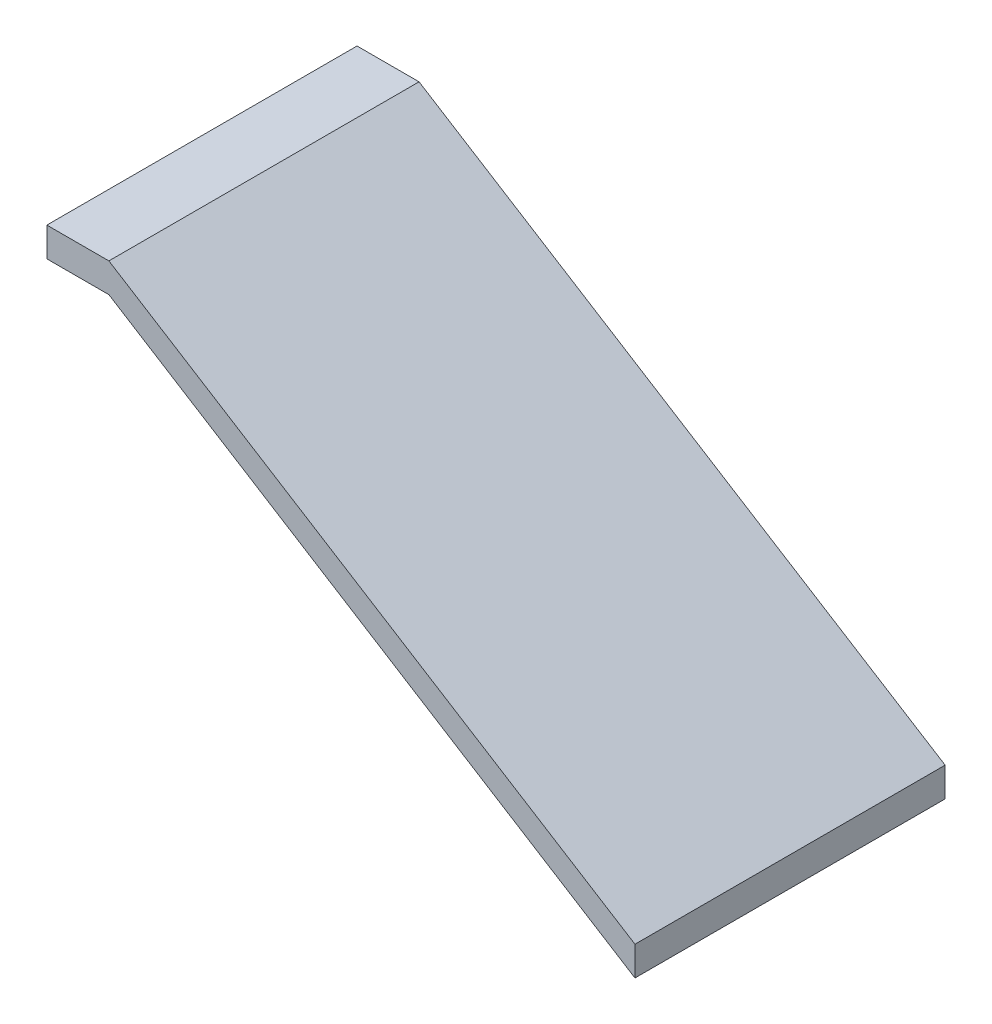
ISO-10303-21;
HEADER;
FILE_DESCRIPTION(('STEP AP214'),'2;1');
FILE_NAME('part.step','',(''),(''),'','','');
FILE_SCHEMA(('AUTOMOTIVE_DESIGN { 1 0 10303 214 1 1 1 1 }'));
ENDSEC;
DATA;
#1=APPLICATION_CONTEXT('core data for automotive mechanical design processes');
#2=APPLICATION_PROTOCOL_DEFINITION('international standard','automotive_design',2000,#1);
#3=PRODUCT_CONTEXT('',#1,'mechanical');
#4=PRODUCT('Part','Part','',(#3));
#5=PRODUCT_RELATED_PRODUCT_CATEGORY('part','',(#4));
#6=PRODUCT_DEFINITION_FORMATION('','',#4);
#7=PRODUCT_DEFINITION_CONTEXT('part definition',#1,'design');
#8=PRODUCT_DEFINITION('design','',#6,#7);
#9=PRODUCT_DEFINITION_SHAPE('','',#8);
#10=(LENGTH_UNIT() NAMED_UNIT(*) SI_UNIT(.MILLI.,.METRE.));
#11=(NAMED_UNIT(*) PLANE_ANGLE_UNIT() SI_UNIT($,.RADIAN.));
#12=(NAMED_UNIT(*) SI_UNIT($,.STERADIAN.) SOLID_ANGLE_UNIT());
#13=UNCERTAINTY_MEASURE_WITH_UNIT(LENGTH_MEASURE(1.E-05),#10,'distance_accuracy_value','');
#14=(GEOMETRIC_REPRESENTATION_CONTEXT(3) GLOBAL_UNCERTAINTY_ASSIGNED_CONTEXT((#13)) GLOBAL_UNIT_ASSIGNED_CONTEXT((#10,
#11,#12)) REPRESENTATION_CONTEXT('',''));
#15=CARTESIAN_POINT('',(0.,0.,0.));
#16=DIRECTION('',(0.,0.,1.));
#17=DIRECTION('',(1.,0.,0.));
#18=AXIS2_PLACEMENT_3D('',#15,#16,#17);
#19=CARTESIAN_POINT('',(50.,609.919264233205,500.));
#20=DIRECTION('',(1.,0.,0.));
#21=DIRECTION('',(0.,0.,-1.));
#22=AXIS2_PLACEMENT_3D('',#19,#20,#21);
#23=PLANE('',#22);
#24=DIRECTION('',(0.,-1.,0.));
#25=VECTOR('',#24,1.);
#26=CARTESIAN_POINT('',(50.,609.919264233205,0.));
#27=LINE('',#26,#25);
#28=CARTESIAN_POINT('',(50.,609.919264233205,0.));
#29=VERTEX_POINT('',#28);
#30=CARTESIAN_POINT('',(50.,562.752128098721,0.));
#31=VERTEX_POINT('',#30);
#32=EDGE_CURVE('E127',#29,#31,#27,.T.);
#33=ORIENTED_EDGE('',*,*,#32,.T.);
#34=DIRECTION('',(0.,0.,-1.));
#35=VECTOR('',#34,1.);
#36=CARTESIAN_POINT('',(50.,562.752128098721,500.));
#37=LINE('',#36,#35);
#38=CARTESIAN_POINT('',(50.,562.752128098721,500.));
#39=VERTEX_POINT('',#38);
#40=EDGE_CURVE('E11',#39,#31,#37,.T.);
#41=ORIENTED_EDGE('',*,*,#40,.F.);
#42=DIRECTION('',(0.,-1.,0.));
#43=VECTOR('',#42,1.);
#44=CARTESIAN_POINT('',(50.,609.919264233205,500.));
#45=LINE('',#44,#43);
#46=CARTESIAN_POINT('',(50.,609.919264233205,500.));
#47=VERTEX_POINT('',#46);
#48=EDGE_CURVE('E137',#47,#39,#45,.T.);
#49=ORIENTED_EDGE('',*,*,#48,.F.);
#50=DIRECTION('',(0.,0.,-1.));
#51=VECTOR('',#50,1.);
#52=CARTESIAN_POINT('',(50.,609.919264233205,500.));
#53=LINE('',#52,#51);
#54=EDGE_CURVE('E123',#47,#29,#53,.T.);
#55=ORIENTED_EDGE('',*,*,#54,.T.);
#56=EDGE_LOOP('',(#33,#41,#49,#55));
#57=FACE_BOUND('',#56,.T.);
#58=ADVANCED_FACE('F43',(#57),#23,.F.);
#59=CARTESIAN_POINT('',(50.,562.752128098721,500.));
#60=DIRECTION('',(0.,1.,0.));
#61=DIRECTION('',(0.,0.,1.));
#62=AXIS2_PLACEMENT_3D('',#59,#60,#61);
#63=PLANE('',#62);
#64=DIRECTION('',(1.,0.,0.));
#65=VECTOR('',#64,1.);
#66=CARTESIAN_POINT('',(50.,562.752128098721,0.));
#67=LINE('',#66,#65);
#68=CARTESIAN_POINT('',(150.,562.752128098721,0.));
#69=VERTEX_POINT('',#68);
#70=EDGE_CURVE('E130',#31,#69,#67,.T.);
#71=ORIENTED_EDGE('',*,*,#70,.T.);
#72=DIRECTION('',(0.,0.,-1.));
#73=VECTOR('',#72,1.);
#74=CARTESIAN_POINT('',(150.,562.752128098721,500.));
#75=LINE('',#74,#73);
#76=CARTESIAN_POINT('',(150.,562.752128098721,500.));
#77=VERTEX_POINT('',#76);
#78=EDGE_CURVE('E51',#77,#69,#75,.T.);
#79=ORIENTED_EDGE('',*,*,#78,.F.);
#80=DIRECTION('',(1.,0.,0.));
#81=VECTOR('',#80,1.);
#82=CARTESIAN_POINT('',(50.,562.752128098721,500.));
#83=LINE('',#82,#81);
#84=EDGE_CURVE('E96',#39,#77,#83,.T.);
#85=ORIENTED_EDGE('',*,*,#84,.F.);
#86=ORIENTED_EDGE('',*,*,#40,.T.);
#87=EDGE_LOOP('',(#71,#79,#85,#86));
#88=FACE_BOUND('',#87,.T.);
#89=ADVANCED_FACE('F161',(#88),#63,.F.);
#90=CARTESIAN_POINT('',(150.,562.752128098721,500.));
#91=DIRECTION('',(0.529919264233205,0.848048096156426,0.));
#92=DIRECTION('',(-0.848048096156426,0.529919264233205,0.));
#93=AXIS2_PLACEMENT_3D('',#90,#91,#92);
#94=PLANE('',#93);
#95=DIRECTION('',(0.848048096156426,-0.529919264233205,0.));
#96=VECTOR('',#95,1.);
#97=CARTESIAN_POINT('',(150.,562.752128098721,0.));
#98=LINE('',#97,#96);
#99=CARTESIAN_POINT('',(998.048096156426,32.8328638655162,0.));
#100=VERTEX_POINT('',#99);
#101=EDGE_CURVE('E132',#69,#100,#98,.T.);
#102=ORIENTED_EDGE('',*,*,#101,.T.);
#103=DIRECTION('',(0.,0.,-1.));
#104=VECTOR('',#103,1.);
#105=CARTESIAN_POINT('',(998.048096156426,32.8328638655162,500.));
#106=LINE('',#105,#104);
#107=CARTESIAN_POINT('',(998.048096156426,32.8328638655162,500.));
#108=VERTEX_POINT('',#107);
#109=EDGE_CURVE('E118',#108,#100,#106,.T.);
#110=ORIENTED_EDGE('',*,*,#109,.F.);
#111=DIRECTION('',(0.848048096156426,-0.529919264233205,0.));
#112=VECTOR('',#111,1.);
#113=CARTESIAN_POINT('',(150.,562.752128098721,500.));
#114=LINE('',#113,#112);
#115=EDGE_CURVE('E109',#77,#108,#114,.T.);
#116=ORIENTED_EDGE('',*,*,#115,.F.);
#117=ORIENTED_EDGE('',*,*,#78,.T.);
#118=EDGE_LOOP('',(#102,#110,#116,#117));
#119=FACE_BOUND('',#118,.T.);
#120=ADVANCED_FACE('F143',(#119),#94,.F.);
#121=CARTESIAN_POINT('',(998.048096156426,32.8328638655162,500.));
#122=DIRECTION('',(-1.,0.,0.));
#123=DIRECTION('',(0.,0.,1.));
#124=AXIS2_PLACEMENT_3D('',#121,#122,#123);
#125=PLANE('',#124);
#126=DIRECTION('',(0.,1.,0.));
#127=VECTOR('',#126,1.);
#128=CARTESIAN_POINT('',(998.048096156426,32.8328638655162,0.));
#129=LINE('',#128,#127);
#130=CARTESIAN_POINT('',(998.048096156426,80.,0.));
#131=VERTEX_POINT('',#130);
#132=EDGE_CURVE('E117',#100,#131,#129,.T.);
#133=ORIENTED_EDGE('',*,*,#132,.T.);
#134=DIRECTION('',(0.,0.,-1.));
#135=VECTOR('',#134,1.);
#136=CARTESIAN_POINT('',(998.048096156426,80.,500.));
#137=LINE('',#136,#135);
#138=CARTESIAN_POINT('',(998.048096156426,80.,500.));
#139=VERTEX_POINT('',#138);
#140=EDGE_CURVE('E114',#139,#131,#137,.T.);
#141=ORIENTED_EDGE('',*,*,#140,.F.);
#142=DIRECTION('',(0.,1.,0.));
#143=VECTOR('',#142,1.);
#144=CARTESIAN_POINT('',(998.048096156426,32.8328638655162,500.));
#145=LINE('',#144,#143);
#146=EDGE_CURVE('E103',#108,#139,#145,.T.);
#147=ORIENTED_EDGE('',*,*,#146,.F.);
#148=ORIENTED_EDGE('',*,*,#109,.T.);
#149=EDGE_LOOP('',(#133,#141,#147,#148));
#150=FACE_BOUND('',#149,.T.);
#151=ADVANCED_FACE('F115',(#150),#125,.F.);
#152=CARTESIAN_POINT('',(998.048096156426,80.,500.));
#153=DIRECTION('',(-0.529919264233205,-0.848048096156426,0.));
#154=DIRECTION('',(0.848048096156426,-0.529919264233205,0.));
#155=AXIS2_PLACEMENT_3D('',#152,#153,#154);
#156=PLANE('',#155);
#157=DIRECTION('',(-0.848048096156426,0.529919264233205,0.));
#158=VECTOR('',#157,1.);
#159=CARTESIAN_POINT('',(998.048096156426,80.,0.));
#160=LINE('',#159,#158);
#161=CARTESIAN_POINT('',(150.,609.919264233205,0.));
#162=VERTEX_POINT('',#161);
#163=EDGE_CURVE('E82',#131,#162,#160,.T.);
#164=ORIENTED_EDGE('',*,*,#163,.T.);
#165=DIRECTION('',(0.,0.,-1.));
#166=VECTOR('',#165,1.);
#167=CARTESIAN_POINT('',(150.,609.919264233205,500.));
#168=LINE('',#167,#166);
#169=CARTESIAN_POINT('',(150.,609.919264233205,500.));
#170=VERTEX_POINT('',#169);
#171=EDGE_CURVE('E119',#170,#162,#168,.T.);
#172=ORIENTED_EDGE('',*,*,#171,.F.);
#173=DIRECTION('',(-0.848048096156426,0.529919264233205,0.));
#174=VECTOR('',#173,1.);
#175=CARTESIAN_POINT('',(998.048096156426,80.,500.));
#176=LINE('',#175,#174);
#177=EDGE_CURVE('E107',#139,#170,#176,.T.);
#178=ORIENTED_EDGE('',*,*,#177,.F.);
#179=ORIENTED_EDGE('',*,*,#140,.T.);
#180=EDGE_LOOP('',(#164,#172,#178,#179));
#181=FACE_BOUND('',#180,.T.);
#182=ADVANCED_FACE('F121',(#181),#156,.F.);
#183=CARTESIAN_POINT('',(150.,609.919264233205,500.));
#184=DIRECTION('',(0.,-1.,0.));
#185=DIRECTION('',(0.,0.,-1.));
#186=AXIS2_PLACEMENT_3D('',#183,#184,#185);
#187=PLANE('',#186);
#188=DIRECTION('',(-1.,0.,0.));
#189=VECTOR('',#188,1.);
#190=CARTESIAN_POINT('',(150.,609.919264233205,0.));
#191=LINE('',#190,#189);
#192=EDGE_CURVE('E88',#162,#29,#191,.T.);
#193=ORIENTED_EDGE('',*,*,#192,.T.);
#194=ORIENTED_EDGE('',*,*,#54,.F.);
#195=DIRECTION('',(-1.,0.,0.));
#196=VECTOR('',#195,1.);
#197=CARTESIAN_POINT('',(150.,609.919264233205,500.));
#198=LINE('',#197,#196);
#199=EDGE_CURVE('E59',#170,#47,#198,.T.);
#200=ORIENTED_EDGE('',*,*,#199,.F.);
#201=ORIENTED_EDGE('',*,*,#171,.T.);
#202=EDGE_LOOP('',(#193,#194,#200,#201));
#203=FACE_BOUND('',#202,.T.);
#204=ADVANCED_FACE('F150',(#203),#187,.F.);
#205=CARTESIAN_POINT('',(0.,0.,500.));
#206=DIRECTION('',(0.,0.,1.));
#207=DIRECTION('',(1.,0.,0.));
#208=AXIS2_PLACEMENT_3D('',#205,#206,#207);
#209=PLANE('',#208);
#210=ORIENTED_EDGE('',*,*,#48,.T.);
#211=ORIENTED_EDGE('',*,*,#84,.T.);
#212=ORIENTED_EDGE('',*,*,#115,.T.);
#213=ORIENTED_EDGE('',*,*,#146,.T.);
#214=ORIENTED_EDGE('',*,*,#177,.T.);
#215=ORIENTED_EDGE('',*,*,#199,.T.);
#216=EDGE_LOOP('',(#210,#211,#212,#213,#214,#215));
#217=FACE_BOUND('',#216,.T.);
#218=ADVANCED_FACE('F105',(#217),#209,.T.);
#219=CARTESIAN_POINT('',(0.,0.,0.));
#220=DIRECTION('',(0.,0.,1.));
#221=DIRECTION('',(1.,0.,0.));
#222=AXIS2_PLACEMENT_3D('',#219,#220,#221);
#223=PLANE('',#222);
#224=ORIENTED_EDGE('',*,*,#32,.F.);
#225=ORIENTED_EDGE('',*,*,#192,.F.);
#226=ORIENTED_EDGE('',*,*,#163,.F.);
#227=ORIENTED_EDGE('',*,*,#132,.F.);
#228=ORIENTED_EDGE('',*,*,#101,.F.);
#229=ORIENTED_EDGE('',*,*,#70,.F.);
#230=EDGE_LOOP('',(#224,#225,#226,#227,#228,#229));
#231=FACE_BOUND('',#230,.T.);
#232=ADVANCED_FACE('F146',(#231),#223,.F.);
#233=CLOSED_SHELL('',(#58,#89,#120,#151,#182,#204,#218,#232));
#234=MANIFOLD_SOLID_BREP('B2',#233);
#235=ADVANCED_BREP_SHAPE_REPRESENTATION('',(#18,#234),#14);
#236=SHAPE_DEFINITION_REPRESENTATION(#9,#235);
ENDSEC;
END-ISO-10303-21;
